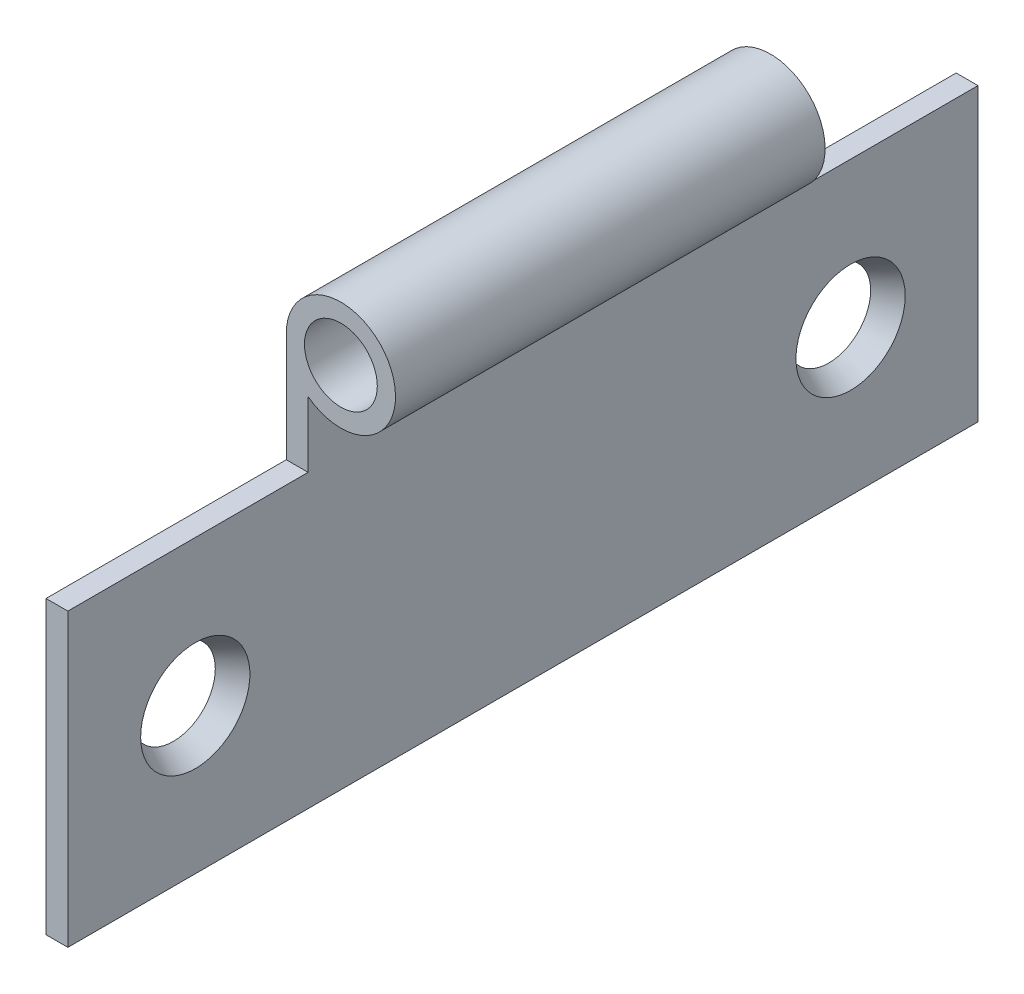
ISO-10303-21;
HEADER;
FILE_DESCRIPTION(('STEP AP214'),'2;1');
FILE_NAME('part.step','',(''),(''),'','','');
FILE_SCHEMA(('AUTOMOTIVE_DESIGN { 1 0 10303 214 1 1 1 1 }'));
ENDSEC;
DATA;
#1=APPLICATION_CONTEXT('core data for automotive mechanical design processes');
#2=APPLICATION_PROTOCOL_DEFINITION('international standard','automotive_design',2000,#1);
#3=PRODUCT_CONTEXT('',#1,'mechanical');
#4=PRODUCT('Part','Part','',(#3));
#5=PRODUCT_RELATED_PRODUCT_CATEGORY('part','',(#4));
#6=PRODUCT_DEFINITION_FORMATION('','',#4);
#7=PRODUCT_DEFINITION_CONTEXT('part definition',#1,'design');
#8=PRODUCT_DEFINITION('design','',#6,#7);
#9=PRODUCT_DEFINITION_SHAPE('','',#8);
#10=(LENGTH_UNIT() NAMED_UNIT(*) SI_UNIT(.MILLI.,.METRE.));
#11=(NAMED_UNIT(*) PLANE_ANGLE_UNIT() SI_UNIT($,.RADIAN.));
#12=(NAMED_UNIT(*) SI_UNIT($,.STERADIAN.) SOLID_ANGLE_UNIT());
#13=UNCERTAINTY_MEASURE_WITH_UNIT(LENGTH_MEASURE(1.E-05),#10,'distance_accuracy_value','');
#14=(GEOMETRIC_REPRESENTATION_CONTEXT(3) GLOBAL_UNCERTAINTY_ASSIGNED_CONTEXT((#13)) GLOBAL_UNIT_ASSIGNED_CONTEXT((#10,
#11,#12)) REPRESENTATION_CONTEXT('',''));
#15=CARTESIAN_POINT('',(0.,0.,0.));
#16=DIRECTION('',(0.,0.,1.));
#17=DIRECTION('',(1.,0.,0.));
#18=AXIS2_PLACEMENT_3D('',#15,#16,#17);
#19=CARTESIAN_POINT('',(0.6,0.,12.5));
#20=DIRECTION('',(-1.,0.,0.));
#21=DIRECTION('',(0.,0.,1.));
#22=AXIS2_PLACEMENT_3D('',#19,#20,#21);
#23=PLANE('',#22);
#24=CARTESIAN_POINT('',(0.6,4.,9.));
#25=DIRECTION('',(-1.,0.,0.));
#26=DIRECTION('',(0.,0.,1.));
#27=AXIS2_PLACEMENT_3D('',#24,#25,#26);
#28=CIRCLE('',#27,1.5);
#29=CARTESIAN_POINT('',(0.6,4.,10.5));
#30=VERTEX_POINT('',#29);
#31=EDGE_CURVE('E261',#30,#30,#28,.T.);
#32=ORIENTED_EDGE('',*,*,#31,.T.);
#33=EDGE_LOOP('',(#32));
#34=FACE_BOUND('',#33,.T.);
#35=CARTESIAN_POINT('',(0.6,4.,-9.));
#36=DIRECTION('',(1.,0.,0.));
#37=DIRECTION('',(0.,0.,-1.));
#38=AXIS2_PLACEMENT_3D('',#35,#36,#37);
#39=CIRCLE('',#38,1.5);
#40=CARTESIAN_POINT('',(0.6,4.,-10.5));
#41=VERTEX_POINT('',#40);
#42=EDGE_CURVE('E180',#41,#41,#39,.T.);
#43=ORIENTED_EDGE('',*,*,#42,.F.);
#44=EDGE_LOOP('',(#43));
#45=FACE_BOUND('',#44,.T.);
#46=DIRECTION('',(0.,0.,1.));
#47=VECTOR('',#46,1.);
#48=CARTESIAN_POINT('',(0.6,8.,12.5));
#49=LINE('',#48,#47);
#50=CARTESIAN_POINT('',(0.6,8.,-12.5));
#51=VERTEX_POINT('',#50);
#52=CARTESIAN_POINT('',(0.600000000000003,8.,-5.9));
#53=VERTEX_POINT('',#52);
#54=EDGE_CURVE('E114',#51,#53,#49,.T.);
#55=ORIENTED_EDGE('',*,*,#54,.T.);
#56=DIRECTION('',(0.,1.,0.));
#57=VECTOR('',#56,1.);
#58=CARTESIAN_POINT('',(0.6,0.,-5.9));
#59=LINE('',#58,#57);
#60=CARTESIAN_POINT('',(0.6,9.8,-5.9));
#61=VERTEX_POINT('',#60);
#62=EDGE_CURVE('E115',#53,#61,#59,.T.);
#63=ORIENTED_EDGE('',*,*,#62,.T.);
#64=DIRECTION('',(0.,0.,1.));
#65=VECTOR('',#64,1.);
#66=CARTESIAN_POINT('',(0.6,9.8,-12.5));
#67=LINE('',#66,#65);
#68=CARTESIAN_POINT('',(0.6,9.8,5.9));
#69=VERTEX_POINT('',#68);
#70=EDGE_CURVE('E62',#61,#69,#67,.T.);
#71=ORIENTED_EDGE('',*,*,#70,.T.);
#72=DIRECTION('',(0.,-1.,0.));
#73=VECTOR('',#72,1.);
#74=CARTESIAN_POINT('',(0.6,0.,5.9));
#75=LINE('',#74,#73);
#76=CARTESIAN_POINT('',(0.600000000000003,8.,5.9));
#77=VERTEX_POINT('',#76);
#78=EDGE_CURVE('E140',#69,#77,#75,.T.);
#79=ORIENTED_EDGE('',*,*,#78,.T.);
#80=DIRECTION('',(0.,0.,1.));
#81=VECTOR('',#80,1.);
#82=CARTESIAN_POINT('',(0.6,8.,12.5));
#83=LINE('',#82,#81);
#84=CARTESIAN_POINT('',(0.6,8.,12.5));
#85=VERTEX_POINT('',#84);
#86=EDGE_CURVE('E144',#77,#85,#83,.T.);
#87=ORIENTED_EDGE('',*,*,#86,.T.);
#88=DIRECTION('',(0.,1.,0.));
#89=VECTOR('',#88,1.);
#90=CARTESIAN_POINT('',(0.6,0.,12.5));
#91=LINE('',#90,#89);
#92=CARTESIAN_POINT('',(0.6,0.,12.5));
#93=VERTEX_POINT('',#92);
#94=EDGE_CURVE('E156',#93,#85,#91,.T.);
#95=ORIENTED_EDGE('',*,*,#94,.F.);
#96=DIRECTION('',(0.,0.,-1.));
#97=VECTOR('',#96,1.);
#98=CARTESIAN_POINT('',(0.6,0.,12.5));
#99=LINE('',#98,#97);
#100=CARTESIAN_POINT('',(0.6,0.,-12.5));
#101=VERTEX_POINT('',#100);
#102=EDGE_CURVE('E165',#93,#101,#99,.T.);
#103=ORIENTED_EDGE('',*,*,#102,.T.);
#104=DIRECTION('',(0.,1.,0.));
#105=VECTOR('',#104,1.);
#106=CARTESIAN_POINT('',(0.6,0.,-12.5));
#107=LINE('',#106,#105);
#108=EDGE_CURVE('E148',#101,#51,#107,.T.);
#109=ORIENTED_EDGE('',*,*,#108,.T.);
#110=EDGE_LOOP('',(#55,#63,#71,#79,#87,#95,#103,#109));
#111=FACE_BOUND('',#110,.T.);
#112=ADVANCED_FACE('F36',(#34,#45,#111),#23,.F.);
#113=CARTESIAN_POINT('',(0.,0.,12.5));
#114=DIRECTION('',(-1.,0.,0.));
#115=DIRECTION('',(0.,0.,1.));
#116=AXIS2_PLACEMENT_3D('',#113,#114,#115);
#117=PLANE('',#116);
#118=CARTESIAN_POINT('',(0.,4.,9.));
#119=DIRECTION('',(1.,0.,0.));
#120=DIRECTION('',(0.,0.,-1.));
#121=AXIS2_PLACEMENT_3D('',#118,#119,#120);
#122=CIRCLE('',#121,1.15);
#123=CARTESIAN_POINT('',(0.,4.,7.85));
#124=VERTEX_POINT('',#123);
#125=EDGE_CURVE('E193',#124,#124,#122,.T.);
#126=ORIENTED_EDGE('',*,*,#125,.T.);
#127=EDGE_LOOP('',(#126));
#128=FACE_BOUND('',#127,.T.);
#129=CARTESIAN_POINT('',(0.,4.,-9.));
#130=DIRECTION('',(-1.,0.,0.));
#131=DIRECTION('',(0.,0.,1.));
#132=AXIS2_PLACEMENT_3D('',#129,#130,#131);
#133=CIRCLE('',#132,1.15);
#134=CARTESIAN_POINT('',(0.,4.,-7.85));
#135=VERTEX_POINT('',#134);
#136=EDGE_CURVE('E119',#135,#135,#133,.T.);
#137=ORIENTED_EDGE('',*,*,#136,.F.);
#138=EDGE_LOOP('',(#137));
#139=FACE_BOUND('',#138,.T.);
#140=DIRECTION('',(0.,1.,0.));
#141=VECTOR('',#140,1.);
#142=CARTESIAN_POINT('',(0.,0.,-5.9));
#143=LINE('',#142,#141);
#144=CARTESIAN_POINT('',(0.,8.,-5.9));
#145=VERTEX_POINT('',#144);
#146=CARTESIAN_POINT('',(0.,11.,-5.9));
#147=VERTEX_POINT('',#146);
#148=EDGE_CURVE('E54',#145,#147,#143,.T.);
#149=ORIENTED_EDGE('',*,*,#148,.F.);
#150=DIRECTION('',(0.,0.,1.));
#151=VECTOR('',#150,1.);
#152=CARTESIAN_POINT('',(0.,8.,12.5));
#153=LINE('',#152,#151);
#154=CARTESIAN_POINT('',(0.,8.,-12.5));
#155=VERTEX_POINT('',#154);
#156=EDGE_CURVE('E106',#155,#145,#153,.T.);
#157=ORIENTED_EDGE('',*,*,#156,.F.);
#158=DIRECTION('',(0.,1.,0.));
#159=VECTOR('',#158,1.);
#160=CARTESIAN_POINT('',(0.,0.,-12.5));
#161=LINE('',#160,#159);
#162=CARTESIAN_POINT('',(0.,0.,-12.5));
#163=VERTEX_POINT('',#162);
#164=EDGE_CURVE('E151',#163,#155,#161,.T.);
#165=ORIENTED_EDGE('',*,*,#164,.F.);
#166=DIRECTION('',(0.,0.,-1.));
#167=VECTOR('',#166,1.);
#168=CARTESIAN_POINT('',(0.,0.,12.5));
#169=LINE('',#168,#167);
#170=CARTESIAN_POINT('',(0.,0.,12.5));
#171=VERTEX_POINT('',#170);
#172=EDGE_CURVE('E167',#171,#163,#169,.T.);
#173=ORIENTED_EDGE('',*,*,#172,.F.);
#174=DIRECTION('',(0.,1.,0.));
#175=VECTOR('',#174,1.);
#176=CARTESIAN_POINT('',(0.,0.,12.5));
#177=LINE('',#176,#175);
#178=CARTESIAN_POINT('',(0.,8.,12.5));
#179=VERTEX_POINT('',#178);
#180=EDGE_CURVE('E159',#171,#179,#177,.T.);
#181=ORIENTED_EDGE('',*,*,#180,.T.);
#182=DIRECTION('',(0.,0.,1.));
#183=VECTOR('',#182,1.);
#184=CARTESIAN_POINT('',(0.,8.,12.5));
#185=LINE('',#184,#183);
#186=CARTESIAN_POINT('',(0.,8.,5.9));
#187=VERTEX_POINT('',#186);
#188=EDGE_CURVE('E142',#187,#179,#185,.T.);
#189=ORIENTED_EDGE('',*,*,#188,.F.);
#190=DIRECTION('',(0.,-1.,0.));
#191=VECTOR('',#190,1.);
#192=CARTESIAN_POINT('',(0.,0.,5.9));
#193=LINE('',#192,#191);
#194=CARTESIAN_POINT('',(0.,11.,5.9));
#195=VERTEX_POINT('',#194);
#196=EDGE_CURVE('E138',#195,#187,#193,.T.);
#197=ORIENTED_EDGE('',*,*,#196,.F.);
#198=DIRECTION('',(0.,0.,-1.));
#199=VECTOR('',#198,1.);
#200=CARTESIAN_POINT('',(0.,11.,12.5));
#201=LINE('',#200,#199);
#202=EDGE_CURVE('E125',#195,#147,#201,.T.);
#203=ORIENTED_EDGE('',*,*,#202,.T.);
#204=EDGE_LOOP('',(#149,#157,#165,#173,#181,#189,#197,#203));
#205=FACE_BOUND('',#204,.T.);
#206=ADVANCED_FACE('F122',(#128,#139,#205),#117,.T.);
#207=CARTESIAN_POINT('',(0.6,0.,12.5));
#208=DIRECTION('',(0.,-1.,0.));
#209=DIRECTION('',(0.,0.,-1.));
#210=AXIS2_PLACEMENT_3D('',#207,#208,#209);
#211=PLANE('',#210);
#212=DIRECTION('',(-1.,0.,0.));
#213=VECTOR('',#212,1.);
#214=CARTESIAN_POINT('',(0.6,0.,-12.5));
#215=LINE('',#214,#213);
#216=EDGE_CURVE('E153',#101,#163,#215,.T.);
#217=ORIENTED_EDGE('',*,*,#216,.F.);
#218=ORIENTED_EDGE('',*,*,#102,.F.);
#219=DIRECTION('',(-1.,0.,0.));
#220=VECTOR('',#219,1.);
#221=CARTESIAN_POINT('',(0.6,0.,12.5));
#222=LINE('',#221,#220);
#223=EDGE_CURVE('E162',#93,#171,#222,.T.);
#224=ORIENTED_EDGE('',*,*,#223,.T.);
#225=ORIENTED_EDGE('',*,*,#172,.T.);
#226=EDGE_LOOP('',(#217,#218,#224,#225));
#227=FACE_BOUND('',#226,.T.);
#228=ADVANCED_FACE('F205',(#227),#211,.T.);
#229=CARTESIAN_POINT('',(0.6,11.,12.5));
#230=DIRECTION('',(0.,0.,-1.));
#231=DIRECTION('',(-1.,0.,0.));
#232=AXIS2_PLACEMENT_3D('',#229,#230,#231);
#233=PLANE('',#232);
#234=ORIENTED_EDGE('',*,*,#94,.T.);
#235=DIRECTION('',(-1.,0.,0.));
#236=VECTOR('',#235,1.);
#237=CARTESIAN_POINT('',(0.6,8.,12.5));
#238=LINE('',#237,#236);
#239=EDGE_CURVE('E46',#85,#179,#238,.T.);
#240=ORIENTED_EDGE('',*,*,#239,.T.);
#241=ORIENTED_EDGE('',*,*,#180,.F.);
#242=ORIENTED_EDGE('',*,*,#223,.F.);
#243=EDGE_LOOP('',(#234,#240,#241,#242));
#244=FACE_BOUND('',#243,.T.);
#245=ADVANCED_FACE('F208',(#244),#233,.F.);
#246=CARTESIAN_POINT('',(0.6,11.,-12.5));
#247=DIRECTION('',(0.,0.,-1.));
#248=DIRECTION('',(-1.,0.,0.));
#249=AXIS2_PLACEMENT_3D('',#246,#247,#248);
#250=PLANE('',#249);
#251=DIRECTION('',(-1.,0.,0.));
#252=VECTOR('',#251,1.);
#253=CARTESIAN_POINT('',(0.6,8.,-12.5));
#254=LINE('',#253,#252);
#255=EDGE_CURVE('E12',#51,#155,#254,.T.);
#256=ORIENTED_EDGE('',*,*,#255,.F.);
#257=ORIENTED_EDGE('',*,*,#108,.F.);
#258=ORIENTED_EDGE('',*,*,#216,.T.);
#259=ORIENTED_EDGE('',*,*,#164,.T.);
#260=EDGE_LOOP('',(#256,#257,#258,#259));
#261=FACE_BOUND('',#260,.T.);
#262=ADVANCED_FACE('F212',(#261),#250,.T.);
#263=CARTESIAN_POINT('',(1.5,11.,-12.5));
#264=DIRECTION('',(0.,0.,1.));
#265=DIRECTION('',(1.,0.,0.));
#266=AXIS2_PLACEMENT_3D('',#263,#264,#265);
#267=CYLINDRICAL_SURFACE('',#266,1.5);
#268=CARTESIAN_POINT('',(1.5,11.,-5.9));
#269=DIRECTION('',(0.,0.,1.));
#270=DIRECTION('',(0.,-1.,0.));
#271=AXIS2_PLACEMENT_3D('',#268,#269,#270);
#272=CIRCLE('',#271,1.5);
#273=EDGE_CURVE('E126',#147,#61,#272,.F.);
#274=ORIENTED_EDGE('',*,*,#273,.F.);
#275=ORIENTED_EDGE('',*,*,#202,.F.);
#276=CARTESIAN_POINT('',(1.5,11.,5.9));
#277=DIRECTION('',(0.,0.,-1.));
#278=DIRECTION('',(0.,1.,0.));
#279=AXIS2_PLACEMENT_3D('',#276,#277,#278);
#280=CIRCLE('',#279,1.5);
#281=EDGE_CURVE('E136',#69,#195,#280,.F.);
#282=ORIENTED_EDGE('',*,*,#281,.F.);
#283=ORIENTED_EDGE('',*,*,#70,.F.);
#284=EDGE_LOOP('',(#274,#275,#282,#283));
#285=FACE_BOUND('',#284,.T.);
#286=ADVANCED_FACE('F216',(#285),#267,.T.);
#287=CARTESIAN_POINT('',(1.5,11.,-12.5));
#288=DIRECTION('',(0.,0.,1.));
#289=DIRECTION('',(1.,0.,0.));
#290=AXIS2_PLACEMENT_3D('',#287,#288,#289);
#291=CYLINDRICAL_SURFACE('',#290,1.);
#292=CARTESIAN_POINT('',(1.5,11.,-5.9));
#293=DIRECTION('',(0.,0.,1.));
#294=DIRECTION('',(0.,-1.,0.));
#295=AXIS2_PLACEMENT_3D('',#292,#293,#294);
#296=CIRCLE('',#295,1.);
#297=CARTESIAN_POINT('',(1.5,10.,-5.9));
#298=VERTEX_POINT('',#297);
#299=EDGE_CURVE('E118',#298,#298,#296,.F.);
#300=ORIENTED_EDGE('',*,*,#299,.T.);
#301=EDGE_LOOP('',(#300));
#302=FACE_BOUND('',#301,.T.);
#303=CARTESIAN_POINT('',(1.5,11.,5.9));
#304=DIRECTION('',(0.,0.,-1.));
#305=DIRECTION('',(0.,1.,0.));
#306=AXIS2_PLACEMENT_3D('',#303,#304,#305);
#307=CIRCLE('',#306,1.);
#308=CARTESIAN_POINT('',(1.5,12.,5.9));
#309=VERTEX_POINT('',#308);
#310=EDGE_CURVE('E135',#309,#309,#307,.F.);
#311=ORIENTED_EDGE('',*,*,#310,.T.);
#312=EDGE_LOOP('',(#311));
#313=FACE_BOUND('',#312,.T.);
#314=ADVANCED_FACE('F220',(#302,#313),#291,.F.);
#315=CARTESIAN_POINT('',(-59.4,8.,13.7703681628692));
#316=DIRECTION('',(0.,-1.,0.));
#317=DIRECTION('',(0.,0.,-1.));
#318=AXIS2_PLACEMENT_3D('',#315,#316,#317);
#319=PLANE('',#318);
#320=DIRECTION('',(1.,0.,0.));
#321=VECTOR('',#320,1.);
#322=CARTESIAN_POINT('',(-59.4,8.,5.9));
#323=LINE('',#322,#321);
#324=EDGE_CURVE('E132',#187,#77,#323,.T.);
#325=ORIENTED_EDGE('',*,*,#324,.F.);
#326=ORIENTED_EDGE('',*,*,#188,.T.);
#327=ORIENTED_EDGE('',*,*,#239,.F.);
#328=ORIENTED_EDGE('',*,*,#86,.F.);
#329=EDGE_LOOP('',(#325,#326,#327,#328));
#330=FACE_BOUND('',#329,.T.);
#331=ADVANCED_FACE('F224',(#330),#319,.F.);
#332=CARTESIAN_POINT('',(-59.4,14.,5.9));
#333=DIRECTION('',(0.,0.,-1.));
#334=DIRECTION('',(0.,1.,0.));
#335=AXIS2_PLACEMENT_3D('',#332,#333,#334);
#336=PLANE('',#335);
#337=ORIENTED_EDGE('',*,*,#310,.F.);
#338=EDGE_LOOP('',(#337));
#339=FACE_BOUND('',#338,.T.);
#340=ORIENTED_EDGE('',*,*,#281,.T.);
#341=ORIENTED_EDGE('',*,*,#196,.T.);
#342=ORIENTED_EDGE('',*,*,#324,.T.);
#343=ORIENTED_EDGE('',*,*,#78,.F.);
#344=EDGE_LOOP('',(#340,#341,#342,#343));
#345=FACE_BOUND('',#344,.T.);
#346=ADVANCED_FACE('F226',(#339,#345),#336,.F.);
#347=CARTESIAN_POINT('',(-59.4,8.,-13.7703681628692));
#348=DIRECTION('',(0.,-1.,0.));
#349=DIRECTION('',(0.,0.,-1.));
#350=AXIS2_PLACEMENT_3D('',#347,#348,#349);
#351=PLANE('',#350);
#352=ORIENTED_EDGE('',*,*,#255,.T.);
#353=ORIENTED_EDGE('',*,*,#156,.T.);
#354=DIRECTION('',(1.,0.,0.));
#355=VECTOR('',#354,1.);
#356=CARTESIAN_POINT('',(-59.4,8.,-5.9));
#357=LINE('',#356,#355);
#358=EDGE_CURVE('E108',#145,#53,#357,.T.);
#359=ORIENTED_EDGE('',*,*,#358,.T.);
#360=ORIENTED_EDGE('',*,*,#54,.F.);
#361=EDGE_LOOP('',(#352,#353,#359,#360));
#362=FACE_BOUND('',#361,.T.);
#363=ADVANCED_FACE('F107',(#362),#351,.F.);
#364=CARTESIAN_POINT('',(-59.4,14.,-5.9));
#365=DIRECTION('',(0.,0.,1.));
#366=DIRECTION('',(0.,-1.,0.));
#367=AXIS2_PLACEMENT_3D('',#364,#365,#366);
#368=PLANE('',#367);
#369=ORIENTED_EDGE('',*,*,#299,.F.);
#370=EDGE_LOOP('',(#369));
#371=FACE_BOUND('',#370,.T.);
#372=ORIENTED_EDGE('',*,*,#358,.F.);
#373=ORIENTED_EDGE('',*,*,#148,.T.);
#374=ORIENTED_EDGE('',*,*,#273,.T.);
#375=ORIENTED_EDGE('',*,*,#62,.F.);
#376=EDGE_LOOP('',(#372,#373,#374,#375));
#377=FACE_BOUND('',#376,.T.);
#378=ADVANCED_FACE('F117',(#371,#377),#368,.F.);
#379=CARTESIAN_POINT('',(0.,4.,-9.));
#380=DIRECTION('',(1.,0.,0.));
#381=DIRECTION('',(0.,0.,-1.));
#382=AXIS2_PLACEMENT_3D('',#379,#380,#381);
#383=CONICAL_SURFACE('',#382,1.15,0.528074448426359);
#384=ORIENTED_EDGE('',*,*,#136,.T.);
#385=EDGE_LOOP('',(#384));
#386=FACE_BOUND('',#385,.T.);
#387=ORIENTED_EDGE('',*,*,#42,.T.);
#388=EDGE_LOOP('',(#387));
#389=FACE_BOUND('',#388,.T.);
#390=ADVANCED_FACE('F235',(#386,#389),#383,.F.);
#391=CARTESIAN_POINT('',(0.,4.,9.));
#392=DIRECTION('',(1.,0.,0.));
#393=DIRECTION('',(0.,0.,1.));
#394=AXIS2_PLACEMENT_3D('',#391,#392,#393);
#395=CONICAL_SURFACE('',#394,1.15,0.528074448426359);
#396=ORIENTED_EDGE('',*,*,#125,.F.);
#397=EDGE_LOOP('',(#396));
#398=FACE_BOUND('',#397,.T.);
#399=ORIENTED_EDGE('',*,*,#31,.F.);
#400=EDGE_LOOP('',(#399));
#401=FACE_BOUND('',#400,.T.);
#402=ADVANCED_FACE('F242',(#398,#401),#395,.F.);
#403=CLOSED_SHELL('',(#112,#206,#228,#245,#262,#286,#314,#331,#346,#363,#378,#390,#402));
#404=MANIFOLD_SOLID_BREP('B2',#403);
#405=ADVANCED_BREP_SHAPE_REPRESENTATION('',(#18,#404),#14);
#406=SHAPE_DEFINITION_REPRESENTATION(#9,#405);
ENDSEC;
END-ISO-10303-21;
